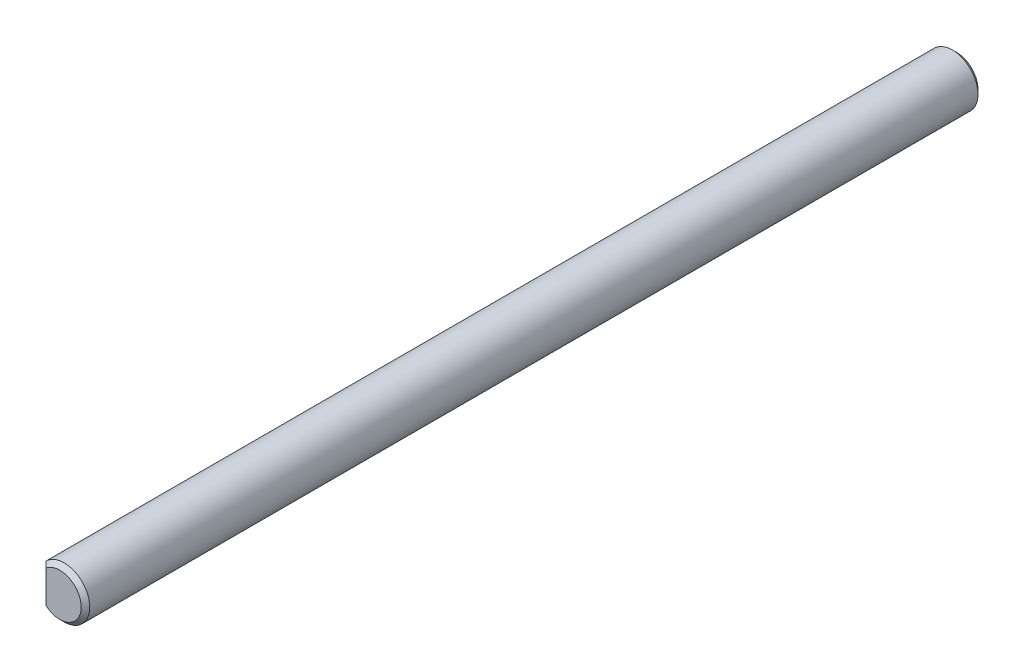
ISO-10303-21;
HEADER;
FILE_DESCRIPTION(('STEP AP214'),'2;1');
FILE_NAME('part.step','',(''),(''),'','','');
FILE_SCHEMA(('AUTOMOTIVE_DESIGN { 1 0 10303 214 1 1 1 1 }'));
ENDSEC;
DATA;
#1=APPLICATION_CONTEXT('core data for automotive mechanical design processes');
#2=APPLICATION_PROTOCOL_DEFINITION('international standard','automotive_design',2000,#1);
#3=PRODUCT_CONTEXT('',#1,'mechanical');
#4=PRODUCT('Part','Part','',(#3));
#5=PRODUCT_RELATED_PRODUCT_CATEGORY('part','',(#4));
#6=PRODUCT_DEFINITION_FORMATION('','',#4);
#7=PRODUCT_DEFINITION_CONTEXT('part definition',#1,'design');
#8=PRODUCT_DEFINITION('design','',#6,#7);
#9=PRODUCT_DEFINITION_SHAPE('','',#8);
#10=(LENGTH_UNIT() NAMED_UNIT(*) SI_UNIT(.MILLI.,.METRE.));
#11=(NAMED_UNIT(*) PLANE_ANGLE_UNIT() SI_UNIT($,.RADIAN.));
#12=(NAMED_UNIT(*) SI_UNIT($,.STERADIAN.) SOLID_ANGLE_UNIT());
#13=UNCERTAINTY_MEASURE_WITH_UNIT(LENGTH_MEASURE(1.E-05),#10,'distance_accuracy_value','');
#14=(GEOMETRIC_REPRESENTATION_CONTEXT(3) GLOBAL_UNCERTAINTY_ASSIGNED_CONTEXT((#13)) GLOBAL_UNIT_ASSIGNED_CONTEXT((#10,
#11,#12)) REPRESENTATION_CONTEXT('',''));
#15=CARTESIAN_POINT('',(0.,0.,0.));
#16=DIRECTION('',(0.,0.,1.));
#17=DIRECTION('',(1.,0.,0.));
#18=AXIS2_PLACEMENT_3D('',#15,#16,#17);
#19=CARTESIAN_POINT('',(0.,0.,105.));
#20=DIRECTION('',(0.,0.,-1.));
#21=DIRECTION('',(-1.,0.,0.));
#22=AXIS2_PLACEMENT_3D('',#19,#20,#21);
#23=CYLINDRICAL_SURFACE('',#22,3.);
#24=DIRECTION('',(0.,0.,1.));
#25=VECTOR('',#24,1.);
#26=CARTESIAN_POINT('',(-2.12132034355964,2.12132034355964,95.));
#27=LINE('',#26,#25);
#28=CARTESIAN_POINT('',(-2.12132034355964,2.12132034355964,95.));
#29=VERTEX_POINT('',#28);
#30=CARTESIAN_POINT('',(-2.12132034355964,2.12132034355964,104.5));
#31=VERTEX_POINT('',#30);
#32=EDGE_CURVE('E140',#29,#31,#27,.T.);
#33=ORIENTED_EDGE('',*,*,#32,.T.);
#34=CARTESIAN_POINT('',(0.,0.,104.5));
#35=DIRECTION('',(0.,0.,1.));
#36=DIRECTION('',(1.,0.,0.));
#37=AXIS2_PLACEMENT_3D('',#34,#35,#36);
#38=CIRCLE('',#37,3.);
#39=CARTESIAN_POINT('',(-2.12132034355964,-2.12132034355964,104.5));
#40=VERTEX_POINT('',#39);
#41=EDGE_CURVE('E173',#31,#40,#38,.F.);
#42=ORIENTED_EDGE('',*,*,#41,.T.);
#43=DIRECTION('',(0.,0.,1.));
#44=VECTOR('',#43,1.);
#45=CARTESIAN_POINT('',(-2.12132034355964,-2.12132034355964,95.));
#46=LINE('',#45,#44);
#47=CARTESIAN_POINT('',(-2.12132034355964,-2.12132034355964,95.));
#48=VERTEX_POINT('',#47);
#49=EDGE_CURVE('E139',#48,#40,#46,.T.);
#50=ORIENTED_EDGE('',*,*,#49,.F.);
#51=CARTESIAN_POINT('',(0.,0.,95.));
#52=DIRECTION('',(0.,0.,1.));
#53=DIRECTION('',(1.,0.,0.));
#54=AXIS2_PLACEMENT_3D('',#51,#52,#53);
#55=CIRCLE('',#54,3.);
#56=EDGE_CURVE('E125',#29,#48,#55,.T.);
#57=ORIENTED_EDGE('',*,*,#56,.F.);
#58=EDGE_LOOP('',(#33,#42,#50,#57));
#59=FACE_BOUND('',#58,.T.);
#60=DIRECTION('',(0.,0.,-1.));
#61=VECTOR('',#60,1.);
#62=CARTESIAN_POINT('',(-2.12132034355964,-2.12132034355964,30.));
#63=LINE('',#62,#61);
#64=CARTESIAN_POINT('',(-2.12132034355964,-2.12132034355964,30.));
#65=VERTEX_POINT('',#64);
#66=CARTESIAN_POINT('',(-2.12132034355964,-2.12132034355964,0.5));
#67=VERTEX_POINT('',#66);
#68=EDGE_CURVE('E155',#65,#67,#63,.T.);
#69=ORIENTED_EDGE('',*,*,#68,.T.);
#70=CARTESIAN_POINT('',(0.,0.,0.5));
#71=DIRECTION('',(0.,0.,1.));
#72=DIRECTION('',(1.,0.,0.));
#73=AXIS2_PLACEMENT_3D('',#70,#71,#72);
#74=CIRCLE('',#73,3.);
#75=CARTESIAN_POINT('',(-2.12132034355964,2.12132034355964,0.5));
#76=VERTEX_POINT('',#75);
#77=EDGE_CURVE('E177',#67,#76,#74,.T.);
#78=ORIENTED_EDGE('',*,*,#77,.T.);
#79=DIRECTION('',(0.,0.,-1.));
#80=VECTOR('',#79,1.);
#81=CARTESIAN_POINT('',(-2.12132034355964,2.12132034355964,30.));
#82=LINE('',#81,#80);
#83=CARTESIAN_POINT('',(-2.12132034355964,2.12132034355964,30.));
#84=VERTEX_POINT('',#83);
#85=EDGE_CURVE('E154',#84,#76,#82,.T.);
#86=ORIENTED_EDGE('',*,*,#85,.F.);
#87=CARTESIAN_POINT('',(0.,0.,30.));
#88=DIRECTION('',(0.,0.,-1.));
#89=DIRECTION('',(-1.,0.,0.));
#90=AXIS2_PLACEMENT_3D('',#87,#88,#89);
#91=CIRCLE('',#90,3.);
#92=EDGE_CURVE('E144',#65,#84,#91,.T.);
#93=ORIENTED_EDGE('',*,*,#92,.F.);
#94=EDGE_LOOP('',(#69,#78,#86,#93));
#95=FACE_BOUND('',#94,.T.);
#96=ADVANCED_FACE('F50',(#59,#95),#23,.T.);
#97=CARTESIAN_POINT('',(0.,0.,105.));
#98=DIRECTION('',(0.,0.,1.));
#99=DIRECTION('',(1.,0.,0.));
#100=AXIS2_PLACEMENT_3D('',#97,#98,#99);
#101=PLANE('',#100);
#102=DIRECTION('',(0.,-1.,0.));
#103=VECTOR('',#102,1.);
#104=CARTESIAN_POINT('',(-1.62132034355961,-2.12132034355964,105.));
#105=LINE('',#104,#103);
#106=CARTESIAN_POINT('',(-1.62132034355961,1.902976705995,105.));
#107=VERTEX_POINT('',#106);
#108=CARTESIAN_POINT('',(-1.62132034355961,-1.902976705995,105.));
#109=VERTEX_POINT('',#108);
#110=EDGE_CURVE('E73',#107,#109,#105,.T.);
#111=ORIENTED_EDGE('',*,*,#110,.T.);
#112=CARTESIAN_POINT('',(0.,0.,105.));
#113=DIRECTION('',(0.,0.,1.));
#114=DIRECTION('',(1.,0.,0.));
#115=AXIS2_PLACEMENT_3D('',#112,#113,#114);
#116=CIRCLE('',#115,2.49999999999997);
#117=EDGE_CURVE('E66',#109,#107,#116,.T.);
#118=ORIENTED_EDGE('',*,*,#117,.T.);
#119=EDGE_LOOP('',(#111,#118));
#120=FACE_BOUND('',#119,.T.);
#121=ADVANCED_FACE('F241',(#120),#101,.T.);
#122=CARTESIAN_POINT('',(0.,0.,0.));
#123=DIRECTION('',(0.,0.,1.));
#124=DIRECTION('',(1.,0.,0.));
#125=AXIS2_PLACEMENT_3D('',#122,#123,#124);
#126=PLANE('',#125);
#127=CARTESIAN_POINT('',(0.,0.,0.));
#128=DIRECTION('',(0.,0.,1.));
#129=DIRECTION('',(1.,0.,0.));
#130=AXIS2_PLACEMENT_3D('',#127,#128,#129);
#131=CIRCLE('',#130,2.5);
#132=CARTESIAN_POINT('',(-1.62132034355965,1.90297670599502,0.));
#133=VERTEX_POINT('',#132);
#134=CARTESIAN_POINT('',(-1.62132034355965,-1.90297670599502,0.));
#135=VERTEX_POINT('',#134);
#136=EDGE_CURVE('E166',#133,#135,#131,.F.);
#137=ORIENTED_EDGE('',*,*,#136,.T.);
#138=DIRECTION('',(0.,1.,0.));
#139=VECTOR('',#138,1.);
#140=CARTESIAN_POINT('',(-1.62132034355965,0.,0.));
#141=LINE('',#140,#139);
#142=EDGE_CURVE('E169',#135,#133,#141,.T.);
#143=ORIENTED_EDGE('',*,*,#142,.T.);
#144=EDGE_LOOP('',(#137,#143));
#145=FACE_BOUND('',#144,.T.);
#146=CARTESIAN_POINT('',(0.,0.,0.));
#147=DIRECTION('',(0.,0.,-1.));
#148=DIRECTION('',(-1.,0.,0.));
#149=AXIS2_PLACEMENT_3D('',#146,#147,#148);
#150=CIRCLE('',#149,1.24999999999999);
#151=CARTESIAN_POINT('',(-1.24999999999999,0.,0.));
#152=VERTEX_POINT('',#151);
#153=EDGE_CURVE('E126',#152,#152,#150,.T.);
#154=ORIENTED_EDGE('',*,*,#153,.F.);
#155=EDGE_LOOP('',(#154));
#156=FACE_BOUND('',#155,.T.);
#157=ADVANCED_FACE('F246',(#145,#156),#126,.F.);
#158=CARTESIAN_POINT('',(-2.12132034355964,0.,30.));
#159=DIRECTION('',(1.,0.,0.));
#160=DIRECTION('',(0.,0.,-1.));
#161=AXIS2_PLACEMENT_3D('',#158,#159,#160);
#162=PLANE('',#161);
#163=ORIENTED_EDGE('',*,*,#85,.T.);
#164=DIRECTION('',(0.,-1.,0.));
#165=VECTOR('',#164,1.);
#166=CARTESIAN_POINT('',(-2.12132034355964,0.,0.5));
#167=LINE('',#166,#165);
#168=EDGE_CURVE('E159',#76,#67,#167,.T.);
#169=ORIENTED_EDGE('',*,*,#168,.T.);
#170=ORIENTED_EDGE('',*,*,#68,.F.);
#171=DIRECTION('',(0.,-1.,0.));
#172=VECTOR('',#171,1.);
#173=CARTESIAN_POINT('',(-2.12132034355964,0.,30.));
#174=LINE('',#173,#172);
#175=EDGE_CURVE('E150',#84,#65,#174,.T.);
#176=ORIENTED_EDGE('',*,*,#175,.F.);
#177=EDGE_LOOP('',(#163,#169,#170,#176));
#178=FACE_BOUND('',#177,.T.);
#179=ADVANCED_FACE('F250',(#178),#162,.F.);
#180=CARTESIAN_POINT('',(0.,0.,30.));
#181=DIRECTION('',(0.,0.,-1.));
#182=DIRECTION('',(-1.,0.,0.));
#183=AXIS2_PLACEMENT_3D('',#180,#181,#182);
#184=PLANE('',#183);
#185=ORIENTED_EDGE('',*,*,#92,.T.);
#186=ORIENTED_EDGE('',*,*,#175,.T.);
#187=EDGE_LOOP('',(#185,#186));
#188=FACE_BOUND('',#187,.T.);
#189=ADVANCED_FACE('F238',(#188),#184,.T.);
#190=CARTESIAN_POINT('',(-2.12132034355964,0.,95.));
#191=DIRECTION('',(1.,0.,0.));
#192=DIRECTION('',(0.,0.,-1.));
#193=AXIS2_PLACEMENT_3D('',#190,#191,#192);
#194=PLANE('',#193);
#195=ORIENTED_EDGE('',*,*,#49,.T.);
#196=DIRECTION('',(0.,1.,0.));
#197=VECTOR('',#196,1.);
#198=CARTESIAN_POINT('',(-2.12132034355964,2.12132034355964,104.5));
#199=LINE('',#198,#197);
#200=EDGE_CURVE('E11',#40,#31,#199,.T.);
#201=ORIENTED_EDGE('',*,*,#200,.T.);
#202=ORIENTED_EDGE('',*,*,#32,.F.);
#203=DIRECTION('',(0.,1.,0.));
#204=VECTOR('',#203,1.);
#205=CARTESIAN_POINT('',(-2.12132034355964,0.,95.));
#206=LINE('',#205,#204);
#207=EDGE_CURVE('E130',#48,#29,#206,.T.);
#208=ORIENTED_EDGE('',*,*,#207,.F.);
#209=EDGE_LOOP('',(#195,#201,#202,#208));
#210=FACE_BOUND('',#209,.T.);
#211=ADVANCED_FACE('F230',(#210),#194,.F.);
#212=CARTESIAN_POINT('',(0.,0.,95.));
#213=DIRECTION('',(0.,0.,1.));
#214=DIRECTION('',(1.,0.,0.));
#215=AXIS2_PLACEMENT_3D('',#212,#213,#214);
#216=PLANE('',#215);
#217=ORIENTED_EDGE('',*,*,#56,.T.);
#218=ORIENTED_EDGE('',*,*,#207,.T.);
#219=EDGE_LOOP('',(#217,#218));
#220=FACE_BOUND('',#219,.T.);
#221=ADVANCED_FACE('F118',(#220),#216,.T.);
#222=CARTESIAN_POINT('',(0.,0.,10.));
#223=DIRECTION('',(0.,0.,-1.));
#224=DIRECTION('',(-1.,0.,0.));
#225=AXIS2_PLACEMENT_3D('',#222,#223,#224);
#226=CONICAL_SURFACE('',#225,1.25,1.02974425867665);
#227=CARTESIAN_POINT('',(0.,0.,10.7510757737845));
#228=VERTEX_POINT('',#227);
#229=VERTEX_LOOP('',#228);
#230=FACE_BOUND('',#229,.T.);
#231=CARTESIAN_POINT('',(0.,0.,10.));
#232=DIRECTION('',(0.,0.,-1.));
#233=DIRECTION('',(-1.,0.,0.));
#234=AXIS2_PLACEMENT_3D('',#231,#232,#233);
#235=CIRCLE('',#234,1.25);
#236=CARTESIAN_POINT('',(-1.25,0.,10.));
#237=VERTEX_POINT('',#236);
#238=EDGE_CURVE('E122',#237,#237,#235,.T.);
#239=ORIENTED_EDGE('',*,*,#238,.T.);
#240=EDGE_LOOP('',(#239));
#241=FACE_BOUND('',#240,.T.);
#242=ADVANCED_FACE('F114',(#230,#241),#226,.F.);
#243=CARTESIAN_POINT('',(0.,0.,0.));
#244=DIRECTION('',(0.,0.,-1.));
#245=DIRECTION('',(-1.,0.,0.));
#246=AXIS2_PLACEMENT_3D('',#243,#244,#245);
#247=CYLINDRICAL_SURFACE('',#246,1.24999999999999);
#248=ORIENTED_EDGE('',*,*,#238,.F.);
#249=EDGE_LOOP('',(#248));
#250=FACE_BOUND('',#249,.T.);
#251=ORIENTED_EDGE('',*,*,#153,.T.);
#252=EDGE_LOOP('',(#251));
#253=FACE_BOUND('',#252,.T.);
#254=ADVANCED_FACE('F117',(#250,#253),#247,.F.);
#255=CARTESIAN_POINT('',(0.,0.,0.5));
#256=DIRECTION('',(0.,0.,1.));
#257=DIRECTION('',(1.,0.,0.));
#258=AXIS2_PLACEMENT_3D('',#255,#256,#257);
#259=CONICAL_SURFACE('',#258,3.,0.785398163397446);
#260=CARTESIAN_POINT('',(-2.12132034355964,-2.12132034355964,0.5));
#261=CARTESIAN_POINT('',(-2.07946824443408,-2.10398404183837,0.458147900874439));
#262=CARTESIAN_POINT('',(-2.03765630404226,-2.08645305099907,0.416335960482617));
#263=CARTESIAN_POINT('',(-1.95412385957933,-2.05097318427633,0.332803516019687));
#264=CARTESIAN_POINT('',(-1.91240335030657,-2.0330243328784,0.291083006746925));
#265=CARTESIAN_POINT('',(-1.82905945903811,-1.99667798592537,0.207739115478471));
#266=CARTESIAN_POINT('',(-1.78743607829229,-1.97828048463147,0.166115734732643));
#267=CARTESIAN_POINT('',(-1.70429535903778,-1.94100073528574,0.0829750154781397));
#268=CARTESIAN_POINT('',(-1.66277802687255,-1.92211845894994,0.041457683312908));
#269=CARTESIAN_POINT('',(-1.62132034355965,-1.90297670599502,0.));
#270=B_SPLINE_CURVE_WITH_KNOTS('',3,(#260,#261,#262,#263,#264,#265,#266,#267,#268,#269),
.UNSPECIFIED.,.F.,.F.,(4,2,2,2,4),(0.,0.185023480485441,0.370036146248165,0.555051179796542,
0.740077032599696),.UNSPECIFIED.);
#271=EDGE_CURVE('E184',#135,#67,#270,.F.);
#272=ORIENTED_EDGE('',*,*,#271,.F.);
#273=ORIENTED_EDGE('',*,*,#136,.F.);
#274=CARTESIAN_POINT('',(-1.62132034355965,1.90297670599502,0.));
#275=CARTESIAN_POINT('',(-1.66277802687255,1.92211845894994,0.0414576833129078));
#276=CARTESIAN_POINT('',(-1.70429535903778,1.94100073528574,0.0829750154781395));
#277=CARTESIAN_POINT('',(-1.78743607829229,1.97828048463147,0.166115734732643));
#278=CARTESIAN_POINT('',(-1.82905945903811,1.99667798592537,0.207739115478471));
#279=CARTESIAN_POINT('',(-1.91240335030657,2.0330243328784,0.291083006746925));
#280=CARTESIAN_POINT('',(-1.95412385957933,2.05097318427633,0.332803516019687));
#281=CARTESIAN_POINT('',(-2.03765630404226,2.08645305099907,0.416335960482617));
#282=CARTESIAN_POINT('',(-2.07946824443408,2.10398404183837,0.458147900874439));
#283=CARTESIAN_POINT('',(-2.12132034355964,2.12132034355964,0.500000000000001));
#284=B_SPLINE_CURVE_WITH_KNOTS('',3,(#274,#275,#276,#277,#278,#279,#280,#281,#282,#283),
.UNSPECIFIED.,.F.,.F.,(4,2,2,2,4),(0.,0.185025852803155,0.370040886351531,0.555053552114256,
0.740077032599697),.UNSPECIFIED.);
#285=EDGE_CURVE('E133',#76,#133,#284,.F.);
#286=ORIENTED_EDGE('',*,*,#285,.F.);
#287=ORIENTED_EDGE('',*,*,#77,.F.);
#288=EDGE_LOOP('',(#272,#273,#286,#287));
#289=FACE_BOUND('',#288,.T.);
#290=ADVANCED_FACE('F198',(#289),#259,.T.);
#291=CARTESIAN_POINT('',(-2.12132034355964,0.,0.5));
#292=DIRECTION('',(0.707106781186549,0.,0.707106781186546));
#293=DIRECTION('',(0.,-1.,0.));
#294=AXIS2_PLACEMENT_3D('',#291,#292,#293);
#295=PLANE('',#294);
#296=ORIENTED_EDGE('',*,*,#285,.T.);
#297=ORIENTED_EDGE('',*,*,#142,.F.);
#298=ORIENTED_EDGE('',*,*,#271,.T.);
#299=ORIENTED_EDGE('',*,*,#168,.F.);
#300=EDGE_LOOP('',(#296,#297,#298,#299));
#301=FACE_BOUND('',#300,.T.);
#302=ADVANCED_FACE('F202',(#301),#295,.F.);
#303=CARTESIAN_POINT('',(-2.12132034355964,0.,104.5));
#304=DIRECTION('',(-0.707106781186548,0.,0.707106781186548));
#305=DIRECTION('',(0.,-1.,0.));
#306=AXIS2_PLACEMENT_3D('',#303,#304,#305);
#307=PLANE('',#306);
#308=CARTESIAN_POINT('',(-1.62132034355961,1.902976705995,105.));
#309=CARTESIAN_POINT('',(-1.66277802687252,1.92211845894992,104.958542316687));
#310=CARTESIAN_POINT('',(-1.70429535903776,1.94100073528573,104.917024984522));
#311=CARTESIAN_POINT('',(-1.78743607829227,1.97828048463146,104.833884265267));
#312=CARTESIAN_POINT('',(-1.8290594590381,1.99667798592536,104.792260884522));
#313=CARTESIAN_POINT('',(-1.91240335030656,2.0330243328784,104.708916993253));
#314=CARTESIAN_POINT('',(-1.95412385957932,2.05097318427633,104.66719648398));
#315=CARTESIAN_POINT('',(-2.03765630404226,2.08645305099906,104.583664039517));
#316=CARTESIAN_POINT('',(-2.07946824443408,2.10398404183836,104.541852099126));
#317=CARTESIAN_POINT('',(-2.12132034355964,2.12132034355964,104.5));
#318=B_SPLINE_CURVE_WITH_KNOTS('',3,(#308,#309,#310,#311,#312,#313,#314,#315,#316,#317),
.UNSPECIFIED.,.F.,.F.,(4,2,2,2,4),(0.,0.18502585280316,0.370040886351559,0.555053552114293,
0.74007703259974),.UNSPECIFIED.);
#319=EDGE_CURVE('E81',#31,#107,#318,.F.);
#320=ORIENTED_EDGE('',*,*,#319,.F.);
#321=ORIENTED_EDGE('',*,*,#200,.F.);
#322=CARTESIAN_POINT('',(-2.12132034355964,-2.12132034355964,104.5));
#323=CARTESIAN_POINT('',(-2.07946824443408,-2.10398404183837,104.541852099126));
#324=CARTESIAN_POINT('',(-2.03765630404226,-2.08645305099906,104.583664039517));
#325=CARTESIAN_POINT('',(-1.95412385957932,-2.05097318427633,104.66719648398));
#326=CARTESIAN_POINT('',(-1.91240335030656,-2.0330243328784,104.708916993253));
#327=CARTESIAN_POINT('',(-1.8290594590381,-1.99667798592536,104.792260884522));
#328=CARTESIAN_POINT('',(-1.78743607829227,-1.97828048463146,104.833884265267));
#329=CARTESIAN_POINT('',(-1.70429535903776,-1.94100073528573,104.917024984522));
#330=CARTESIAN_POINT('',(-1.66277802687253,-1.92211845894993,104.958542316687));
#331=CARTESIAN_POINT('',(-1.62132034355962,-1.90297670599501,105.));
#332=B_SPLINE_CURVE_WITH_KNOTS('',3,(#322,#323,#324,#325,#326,#327,#328,#329,#330,#331),
.UNSPECIFIED.,.F.,.F.,(4,2,2,2,4),(0.,0.185023480485446,0.37003614624818,0.555051179796565,
0.740077032599737),.UNSPECIFIED.);
#333=EDGE_CURVE('E56',#109,#40,#332,.F.);
#334=ORIENTED_EDGE('',*,*,#333,.F.);
#335=ORIENTED_EDGE('',*,*,#110,.F.);
#336=EDGE_LOOP('',(#320,#321,#334,#335));
#337=FACE_BOUND('',#336,.T.);
#338=ADVANCED_FACE('F207',(#337),#307,.T.);
#339=CARTESIAN_POINT('',(0.,0.,105.));
#340=DIRECTION('',(0.,0.,-1.));
#341=DIRECTION('',(-1.,0.,0.));
#342=AXIS2_PLACEMENT_3D('',#339,#340,#341);
#343=CONICAL_SURFACE('',#342,2.49999999999997,0.785398163397448);
#344=ORIENTED_EDGE('',*,*,#333,.T.);
#345=ORIENTED_EDGE('',*,*,#41,.F.);
#346=ORIENTED_EDGE('',*,*,#319,.T.);
#347=ORIENTED_EDGE('',*,*,#117,.F.);
#348=EDGE_LOOP('',(#344,#345,#346,#347));
#349=FACE_BOUND('',#348,.T.);
#350=ADVANCED_FACE('F53',(#349),#343,.T.);
#351=CLOSED_SHELL('',(#96,#121,#157,#179,#189,#211,#221,#242,#254,#290,#302,#338,#350));
#352=MANIFOLD_SOLID_BREP('B2',#351);
#353=ADVANCED_BREP_SHAPE_REPRESENTATION('',(#18,#352),#14);
#354=SHAPE_DEFINITION_REPRESENTATION(#9,#353);
ENDSEC;
END-ISO-10303-21;
